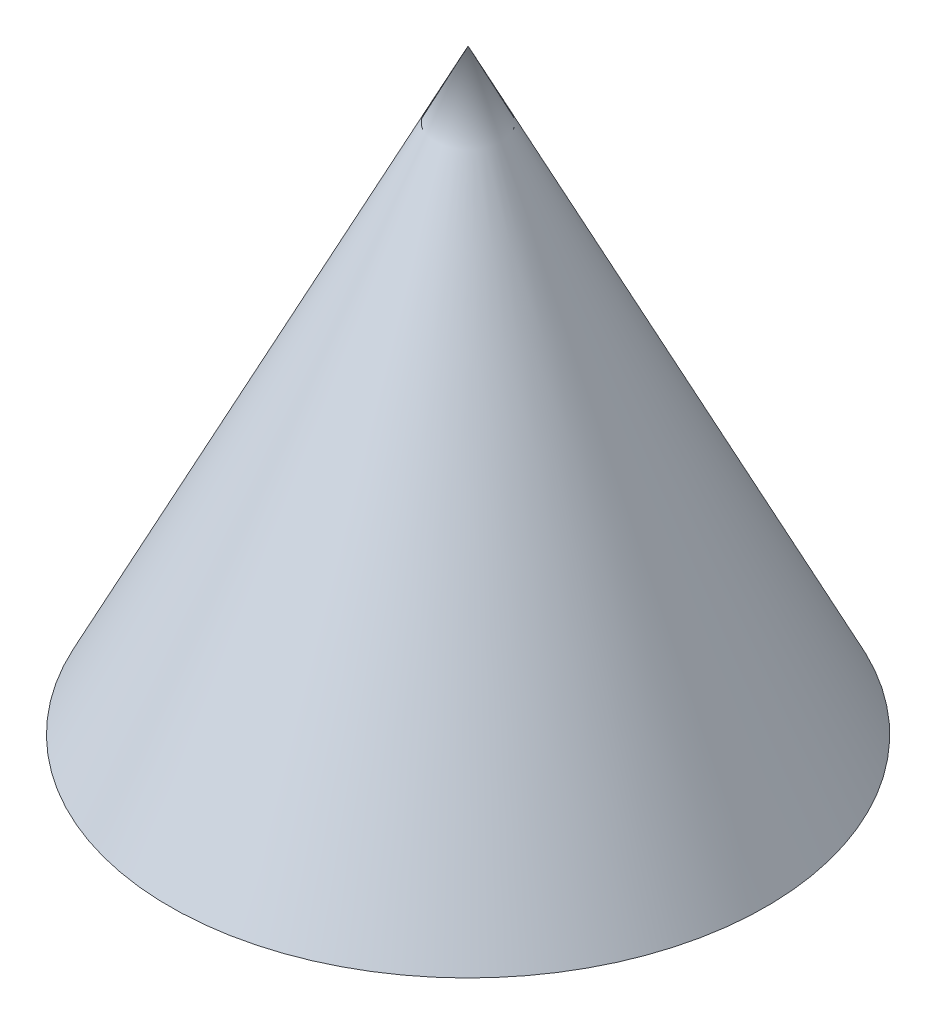
ISO-10303-21;
HEADER;
FILE_DESCRIPTION(('STEP AP214'),'2;1');
FILE_NAME('part.step','',(''),(''),'','','');
FILE_SCHEMA(('AUTOMOTIVE_DESIGN { 1 0 10303 214 1 1 1 1 }'));
ENDSEC;
DATA;
#1=APPLICATION_CONTEXT('core data for automotive mechanical design processes');
#2=APPLICATION_PROTOCOL_DEFINITION('international standard','automotive_design',2000,#1);
#3=PRODUCT_CONTEXT('',#1,'mechanical');
#4=PRODUCT('Part','Part','',(#3));
#5=PRODUCT_RELATED_PRODUCT_CATEGORY('part','',(#4));
#6=PRODUCT_DEFINITION_FORMATION('','',#4);
#7=PRODUCT_DEFINITION_CONTEXT('part definition',#1,'design');
#8=PRODUCT_DEFINITION('design','',#6,#7);
#9=PRODUCT_DEFINITION_SHAPE('','',#8);
#10=(LENGTH_UNIT() NAMED_UNIT(*) SI_UNIT(.MILLI.,.METRE.));
#11=(NAMED_UNIT(*) PLANE_ANGLE_UNIT() SI_UNIT($,.RADIAN.));
#12=(NAMED_UNIT(*) SI_UNIT($,.STERADIAN.) SOLID_ANGLE_UNIT());
#13=UNCERTAINTY_MEASURE_WITH_UNIT(LENGTH_MEASURE(1.E-05),#10,'distance_accuracy_value','');
#14=(GEOMETRIC_REPRESENTATION_CONTEXT(3) GLOBAL_UNCERTAINTY_ASSIGNED_CONTEXT((#13)) GLOBAL_UNIT_ASSIGNED_CONTEXT((#10,
#11,#12)) REPRESENTATION_CONTEXT('',''));
#15=CARTESIAN_POINT('',(0.,0.,0.));
#16=DIRECTION('',(0.,0.,1.));
#17=DIRECTION('',(1.,0.,0.));
#18=AXIS2_PLACEMENT_3D('',#15,#16,#17);
#19=CARTESIAN_POINT('',(0.,0.,0.));
#20=DIRECTION('',(0.,-1.,0.));
#21=DIRECTION('',(0.,0.,-1.));
#22=AXIS2_PLACEMENT_3D('',#19,#20,#21);
#23=PLANE('',#22);
#24=CARTESIAN_POINT('',(0.,0.,0.));
#25=DIRECTION('',(0.,-1.,0.));
#26=DIRECTION('',(0.,0.,-1.));
#27=AXIS2_PLACEMENT_3D('',#24,#25,#26);
#28=CIRCLE('',#27,50.);
#29=CARTESIAN_POINT('',(0.,0.,-50.));
#30=VERTEX_POINT('',#29);
#31=EDGE_CURVE('E11',#30,#30,#28,.T.);
#32=ORIENTED_EDGE('',*,*,#31,.T.);
#33=EDGE_LOOP('',(#32));
#34=FACE_BOUND('',#33,.T.);
#35=ADVANCED_FACE('F41',(#34),#23,.T.);
#36=CARTESIAN_POINT('',(0.,0.,0.));
#37=DIRECTION('',(0.,-1.,0.));
#38=DIRECTION('',(0.,0.,-1.));
#39=AXIS2_PLACEMENT_3D('',#36,#37,#38);
#40=CONICAL_SURFACE('',#39,50.,0.463647609000806);
#41=CARTESIAN_POINT('',(0.,100.,0.));
#42=VERTEX_POINT('',#41);
#43=VERTEX_LOOP('',#42);
#44=FACE_BOUND('',#43,.T.);
#45=ORIENTED_EDGE('',*,*,#31,.F.);
#46=EDGE_LOOP('',(#45));
#47=FACE_BOUND('',#46,.T.);
#48=ADVANCED_FACE('F48',(#44,#47),#40,.T.);
#49=CLOSED_SHELL('',(#35,#48));
#50=MANIFOLD_SOLID_BREP('B2',#49);
#51=ADVANCED_BREP_SHAPE_REPRESENTATION('',(#18,#50),#14);
#52=SHAPE_DEFINITION_REPRESENTATION(#9,#51);
ENDSEC;
END-ISO-10303-21;
